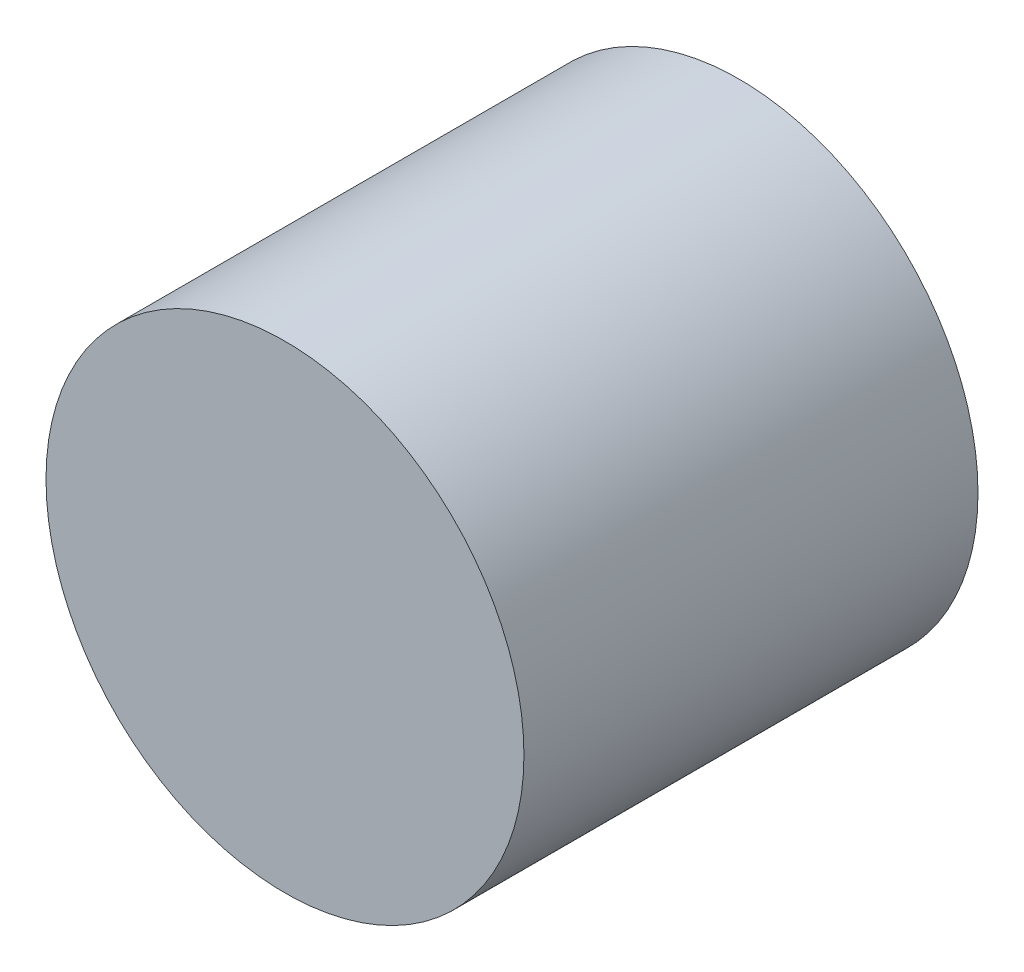
ISO-10303-21;
HEADER;
FILE_DESCRIPTION(('STEP AP214'),'2;1');
FILE_NAME('part.step','',(''),(''),'','','');
FILE_SCHEMA(('AUTOMOTIVE_DESIGN { 1 0 10303 214 1 1 1 1 }'));
ENDSEC;
DATA;
#1=APPLICATION_CONTEXT('core data for automotive mechanical design processes');
#2=APPLICATION_PROTOCOL_DEFINITION('international standard','automotive_design',2000,#1);
#3=PRODUCT_CONTEXT('',#1,'mechanical');
#4=PRODUCT('Part','Part','',(#3));
#5=PRODUCT_RELATED_PRODUCT_CATEGORY('part','',(#4));
#6=PRODUCT_DEFINITION_FORMATION('','',#4);
#7=PRODUCT_DEFINITION_CONTEXT('part definition',#1,'design');
#8=PRODUCT_DEFINITION('design','',#6,#7);
#9=PRODUCT_DEFINITION_SHAPE('','',#8);
#10=(LENGTH_UNIT() NAMED_UNIT(*) SI_UNIT(.MILLI.,.METRE.));
#11=(NAMED_UNIT(*) PLANE_ANGLE_UNIT() SI_UNIT($,.RADIAN.));
#12=(NAMED_UNIT(*) SI_UNIT($,.STERADIAN.) SOLID_ANGLE_UNIT());
#13=UNCERTAINTY_MEASURE_WITH_UNIT(LENGTH_MEASURE(1.E-05),#10,'distance_accuracy_value','');
#14=(GEOMETRIC_REPRESENTATION_CONTEXT(3) GLOBAL_UNCERTAINTY_ASSIGNED_CONTEXT((#13)) GLOBAL_UNIT_ASSIGNED_CONTEXT((#10,
#11,#12)) REPRESENTATION_CONTEXT('',''));
#15=CARTESIAN_POINT('',(0.,0.,0.));
#16=DIRECTION('',(0.,0.,1.));
#17=DIRECTION('',(1.,0.,0.));
#18=AXIS2_PLACEMENT_3D('',#15,#16,#17);
#19=CARTESIAN_POINT('',(-11.,20.,-16.8));
#20=DIRECTION('',(0.,0.,1.));
#21=DIRECTION('',(1.,0.,0.));
#22=AXIS2_PLACEMENT_3D('',#19,#20,#21);
#23=CYLINDRICAL_SURFACE('',#22,2.);
#24=CARTESIAN_POINT('',(-11.,20.,-16.8));
#25=DIRECTION('',(0.,0.,-1.));
#26=DIRECTION('',(-1.,0.,0.));
#27=AXIS2_PLACEMENT_3D('',#24,#25,#26);
#28=CIRCLE('',#27,2.);
#29=CARTESIAN_POINT('',(-13.,20.,-16.8));
#30=VERTEX_POINT('',#29);
#31=EDGE_CURVE('E11',#30,#30,#28,.T.);
#32=ORIENTED_EDGE('',*,*,#31,.F.);
#33=EDGE_LOOP('',(#32));
#34=FACE_BOUND('',#33,.T.);
#35=CARTESIAN_POINT('',(-11.,20.,-13.));
#36=DIRECTION('',(0.,0.,-1.));
#37=DIRECTION('',(-1.,0.,0.));
#38=AXIS2_PLACEMENT_3D('',#35,#36,#37);
#39=CIRCLE('',#38,2.);
#40=CARTESIAN_POINT('',(-13.,20.,-13.));
#41=VERTEX_POINT('',#40);
#42=EDGE_CURVE('E19',#41,#41,#39,.T.);
#43=ORIENTED_EDGE('',*,*,#42,.T.);
#44=EDGE_LOOP('',(#43));
#45=FACE_BOUND('',#44,.T.);
#46=ADVANCED_FACE('F16',(#34,#45),#23,.T.);
#47=CARTESIAN_POINT('',(-11.,20.,-16.8));
#48=DIRECTION('',(0.,0.,-1.));
#49=DIRECTION('',(-1.,0.,0.));
#50=AXIS2_PLACEMENT_3D('',#47,#48,#49);
#51=PLANE('',#50);
#52=DIRECTION('',(-0.602239243405244,-0.798315660439327,0.));
#53=VECTOR('',#52,1.);
#54=CARTESIAN_POINT('',(-9.56747668783013,19.8233356475596,-16.8));
#55=LINE('',#54,#53);
#56=CARTESIAN_POINT('',(-9.56747668783013,19.8233356475596,-16.8));
#57=VERTEX_POINT('',#56);
#58=CARTESIAN_POINT('',(-10.4367341610716,18.6710662439272,-16.8));
#59=VERTEX_POINT('',#58);
#60=EDGE_CURVE('E37',#57,#59,#55,.T.);
#61=ORIENTED_EDGE('',*,*,#60,.F.);
#62=DIRECTION('',(0.390242020476786,-0.920712314164526,0.));
#63=VECTOR('',#62,1.);
#64=CARTESIAN_POINT('',(-10.1307425267586,21.1522694036324,-16.8));
#65=LINE('',#64,#63);
#66=CARTESIAN_POINT('',(-10.1307425267586,21.1522694036324,-16.8));
#67=VERTEX_POINT('',#66);
#68=EDGE_CURVE('E153',#67,#57,#65,.T.);
#69=ORIENTED_EDGE('',*,*,#68,.F.);
#70=DIRECTION('',(0.992481263882031,-0.122396653725201,0.));
#71=VECTOR('',#70,1.);
#72=CARTESIAN_POINT('',(-11.5632658389284,21.3289337560727,-16.8));
#73=LINE('',#72,#71);
#74=CARTESIAN_POINT('',(-11.5632658389284,21.3289337560727,-16.8));
#75=VERTEX_POINT('',#74);
#76=EDGE_CURVE('E150',#75,#67,#73,.T.);
#77=ORIENTED_EDGE('',*,*,#76,.F.);
#78=DIRECTION('',(0.602239243405244,0.798315660439328,0.));
#79=VECTOR('',#78,1.);
#80=CARTESIAN_POINT('',(-12.4325233121699,20.1766643524404,-16.8));
#81=LINE('',#80,#79);
#82=CARTESIAN_POINT('',(-12.4325233121699,20.1766643524404,-16.8));
#83=VERTEX_POINT('',#82);
#84=EDGE_CURVE('E105',#83,#75,#81,.T.);
#85=ORIENTED_EDGE('',*,*,#84,.F.);
#86=DIRECTION('',(-0.390242020476786,0.920712314164525,0.));
#87=VECTOR('',#86,1.);
#88=CARTESIAN_POINT('',(-11.8692574732414,18.8477305963677,-16.8));
#89=LINE('',#88,#87);
#90=CARTESIAN_POINT('',(-11.8692574732414,18.8477305963677,-16.8));
#91=VERTEX_POINT('',#90);
#92=EDGE_CURVE('E144',#91,#83,#89,.T.);
#93=ORIENTED_EDGE('',*,*,#92,.F.);
#94=DIRECTION('',(-0.992481263882031,0.122396653725201,0.));
#95=VECTOR('',#94,1.);
#96=CARTESIAN_POINT('',(-10.4367341610716,18.6710662439272,-16.8));
#97=LINE('',#96,#95);
#98=EDGE_CURVE('E140',#59,#91,#97,.T.);
#99=ORIENTED_EDGE('',*,*,#98,.F.);
#100=EDGE_LOOP('',(#61,#69,#77,#85,#93,#99));
#101=FACE_BOUND('',#100,.T.);
#102=ORIENTED_EDGE('',*,*,#31,.T.);
#103=EDGE_LOOP('',(#102));
#104=FACE_BOUND('',#103,.T.);
#105=ADVANCED_FACE('F172',(#101,#104),#51,.T.);
#106=CARTESIAN_POINT('',(-11.,20.,-13.));
#107=DIRECTION('',(0.,0.,-1.));
#108=DIRECTION('',(-1.,0.,0.));
#109=AXIS2_PLACEMENT_3D('',#106,#107,#108);
#110=PLANE('',#109);
#111=ORIENTED_EDGE('',*,*,#42,.F.);
#112=EDGE_LOOP('',(#111));
#113=FACE_BOUND('',#112,.T.);
#114=ADVANCED_FACE('F221',(#113),#110,.F.);
#115=CARTESIAN_POINT('',(-9.56747668783013,19.8233356475596,-14.8));
#116=DIRECTION('',(0.798315660439327,-0.602239243405244,0.));
#117=DIRECTION('',(0.602239243405244,0.798315660439327,0.));
#118=AXIS2_PLACEMENT_3D('',#115,#116,#117);
#119=PLANE('',#118);
#120=ORIENTED_EDGE('',*,*,#60,.T.);
#121=DIRECTION('',(0.,0.,-1.));
#122=VECTOR('',#121,1.);
#123=CARTESIAN_POINT('',(-10.4367341610716,18.6710662439272,-14.8));
#124=LINE('',#123,#122);
#125=CARTESIAN_POINT('',(-10.4367341610716,18.6710662439272,-14.8));
#126=VERTEX_POINT('',#125);
#127=EDGE_CURVE('E83',#126,#59,#124,.T.);
#128=ORIENTED_EDGE('',*,*,#127,.F.);
#129=DIRECTION('',(-0.602239243405244,-0.798315660439327,0.));
#130=VECTOR('',#129,1.);
#131=CARTESIAN_POINT('',(-9.56747668783013,19.8233356475596,-14.8));
#132=LINE('',#131,#130);
#133=CARTESIAN_POINT('',(-9.56747668783013,19.8233356475596,-14.8));
#134=VERTEX_POINT('',#133);
#135=EDGE_CURVE('E155',#134,#126,#132,.T.);
#136=ORIENTED_EDGE('',*,*,#135,.F.);
#137=DIRECTION('',(0.,0.,-1.));
#138=VECTOR('',#137,1.);
#139=CARTESIAN_POINT('',(-9.56747668783013,19.8233356475596,-14.8));
#140=LINE('',#139,#138);
#141=EDGE_CURVE('E50',#134,#57,#140,.T.);
#142=ORIENTED_EDGE('',*,*,#141,.T.);
#143=EDGE_LOOP('',(#120,#128,#136,#142));
#144=FACE_BOUND('',#143,.T.);
#145=ADVANCED_FACE('F230',(#144),#119,.F.);
#146=CARTESIAN_POINT('',(-10.1307425267586,21.1522694036324,-14.8));
#147=DIRECTION('',(0.920712314164526,0.390242020476786,0.));
#148=DIRECTION('',(-0.390242020476786,0.920712314164526,0.));
#149=AXIS2_PLACEMENT_3D('',#146,#147,#148);
#150=PLANE('',#149);
#151=ORIENTED_EDGE('',*,*,#68,.T.);
#152=ORIENTED_EDGE('',*,*,#141,.F.);
#153=DIRECTION('',(0.390242020476786,-0.920712314164526,0.));
#154=VECTOR('',#153,1.);
#155=CARTESIAN_POINT('',(-10.1307425267586,21.1522694036324,-14.8));
#156=LINE('',#155,#154);
#157=CARTESIAN_POINT('',(-10.1307425267586,21.1522694036324,-14.8));
#158=VERTEX_POINT('',#157);
#159=EDGE_CURVE('E119',#158,#134,#156,.T.);
#160=ORIENTED_EDGE('',*,*,#159,.F.);
#161=DIRECTION('',(0.,0.,-1.));
#162=VECTOR('',#161,1.);
#163=CARTESIAN_POINT('',(-10.1307425267586,21.1522694036324,-14.8));
#164=LINE('',#163,#162);
#165=EDGE_CURVE('E110',#158,#67,#164,.T.);
#166=ORIENTED_EDGE('',*,*,#165,.T.);
#167=EDGE_LOOP('',(#151,#152,#160,#166));
#168=FACE_BOUND('',#167,.T.);
#169=ADVANCED_FACE('F238',(#168),#150,.F.);
#170=CARTESIAN_POINT('',(-11.5632658389284,21.3289337560727,-14.8));
#171=DIRECTION('',(0.122396653725201,0.992481263882031,0.));
#172=DIRECTION('',(-0.992481263882031,0.122396653725201,0.));
#173=AXIS2_PLACEMENT_3D('',#170,#171,#172);
#174=PLANE('',#173);
#175=ORIENTED_EDGE('',*,*,#76,.T.);
#176=ORIENTED_EDGE('',*,*,#165,.F.);
#177=DIRECTION('',(0.992481263882031,-0.122396653725201,0.));
#178=VECTOR('',#177,1.);
#179=CARTESIAN_POINT('',(-11.5632658389284,21.3289337560727,-14.8));
#180=LINE('',#179,#178);
#181=CARTESIAN_POINT('',(-11.5632658389284,21.3289337560727,-14.8));
#182=VERTEX_POINT('',#181);
#183=EDGE_CURVE('E114',#182,#158,#180,.T.);
#184=ORIENTED_EDGE('',*,*,#183,.F.);
#185=DIRECTION('',(0.,0.,-1.));
#186=VECTOR('',#185,1.);
#187=CARTESIAN_POINT('',(-11.5632658389284,21.3289337560727,-14.8));
#188=LINE('',#187,#186);
#189=EDGE_CURVE('E98',#182,#75,#188,.T.);
#190=ORIENTED_EDGE('',*,*,#189,.T.);
#191=EDGE_LOOP('',(#175,#176,#184,#190));
#192=FACE_BOUND('',#191,.T.);
#193=ADVANCED_FACE('F115',(#192),#174,.F.);
#194=CARTESIAN_POINT('',(-12.4325233121699,20.1766643524404,-14.8));
#195=DIRECTION('',(-0.798315660439328,0.602239243405244,0.));
#196=DIRECTION('',(-0.602239243405244,-0.798315660439328,0.));
#197=AXIS2_PLACEMENT_3D('',#194,#195,#196);
#198=PLANE('',#197);
#199=ORIENTED_EDGE('',*,*,#84,.T.);
#200=ORIENTED_EDGE('',*,*,#189,.F.);
#201=DIRECTION('',(0.602239243405244,0.798315660439328,0.));
#202=VECTOR('',#201,1.);
#203=CARTESIAN_POINT('',(-12.4325233121699,20.1766643524404,-14.8));
#204=LINE('',#203,#202);
#205=CARTESIAN_POINT('',(-12.4325233121699,20.1766643524404,-14.8));
#206=VERTEX_POINT('',#205);
#207=EDGE_CURVE('E102',#206,#182,#204,.T.);
#208=ORIENTED_EDGE('',*,*,#207,.F.);
#209=DIRECTION('',(0.,0.,-1.));
#210=VECTOR('',#209,1.);
#211=CARTESIAN_POINT('',(-12.4325233121699,20.1766643524404,-14.8));
#212=LINE('',#211,#210);
#213=EDGE_CURVE('E111',#206,#83,#212,.T.);
#214=ORIENTED_EDGE('',*,*,#213,.T.);
#215=EDGE_LOOP('',(#199,#200,#208,#214));
#216=FACE_BOUND('',#215,.T.);
#217=ADVANCED_FACE('F100',(#216),#198,.F.);
#218=CARTESIAN_POINT('',(-11.8692574732414,18.8477305963677,-14.8));
#219=DIRECTION('',(-0.920712314164525,-0.390242020476786,0.));
#220=DIRECTION('',(0.390242020476786,-0.920712314164525,0.));
#221=AXIS2_PLACEMENT_3D('',#218,#219,#220);
#222=PLANE('',#221);
#223=ORIENTED_EDGE('',*,*,#92,.T.);
#224=ORIENTED_EDGE('',*,*,#213,.F.);
#225=DIRECTION('',(-0.390242020476786,0.920712314164525,0.));
#226=VECTOR('',#225,1.);
#227=CARTESIAN_POINT('',(-11.8692574732414,18.8477305963677,-14.8));
#228=LINE('',#227,#226);
#229=CARTESIAN_POINT('',(-11.8692574732414,18.8477305963677,-14.8));
#230=VERTEX_POINT('',#229);
#231=EDGE_CURVE('E125',#230,#206,#228,.T.);
#232=ORIENTED_EDGE('',*,*,#231,.F.);
#233=DIRECTION('',(0.,0.,-1.));
#234=VECTOR('',#233,1.);
#235=CARTESIAN_POINT('',(-11.8692574732414,18.8477305963677,-14.8));
#236=LINE('',#235,#234);
#237=EDGE_CURVE('E161',#230,#91,#236,.T.);
#238=ORIENTED_EDGE('',*,*,#237,.T.);
#239=EDGE_LOOP('',(#223,#224,#232,#238));
#240=FACE_BOUND('',#239,.T.);
#241=ADVANCED_FACE('F176',(#240),#222,.F.);
#242=CARTESIAN_POINT('',(-10.4367341610716,18.6710662439272,-14.8));
#243=DIRECTION('',(-0.122396653725201,-0.992481263882031,0.));
#244=DIRECTION('',(0.992481263882031,-0.122396653725201,0.));
#245=AXIS2_PLACEMENT_3D('',#242,#243,#244);
#246=PLANE('',#245);
#247=ORIENTED_EDGE('',*,*,#98,.T.);
#248=ORIENTED_EDGE('',*,*,#237,.F.);
#249=DIRECTION('',(-0.992481263882031,0.122396653725201,0.));
#250=VECTOR('',#249,1.);
#251=CARTESIAN_POINT('',(-10.4367341610716,18.6710662439272,-14.8));
#252=LINE('',#251,#250);
#253=EDGE_CURVE('E132',#126,#230,#252,.T.);
#254=ORIENTED_EDGE('',*,*,#253,.F.);
#255=ORIENTED_EDGE('',*,*,#127,.T.);
#256=EDGE_LOOP('',(#247,#248,#254,#255));
#257=FACE_BOUND('',#256,.T.);
#258=ADVANCED_FACE('F169',(#257),#246,.F.);
#259=CARTESIAN_POINT('',(-10.4367341610716,18.6710662439272,-14.8));
#260=DIRECTION('',(0.,0.,-1.));
#261=DIRECTION('',(-1.,0.,0.));
#262=AXIS2_PLACEMENT_3D('',#259,#260,#261);
#263=PLANE('',#262);
#264=ORIENTED_EDGE('',*,*,#135,.T.);
#265=ORIENTED_EDGE('',*,*,#253,.T.);
#266=ORIENTED_EDGE('',*,*,#231,.T.);
#267=ORIENTED_EDGE('',*,*,#207,.T.);
#268=ORIENTED_EDGE('',*,*,#183,.T.);
#269=ORIENTED_EDGE('',*,*,#159,.T.);
#270=EDGE_LOOP('',(#264,#265,#266,#267,#268,#269));
#271=FACE_BOUND('',#270,.T.);
#272=ADVANCED_FACE('F122',(#271),#263,.T.);
#273=CLOSED_SHELL('',(#46,#105,#114,#145,#169,#193,#217,#241,#258,#272));
#274=MANIFOLD_SOLID_BREP('B1',#273);
#275=ADVANCED_BREP_SHAPE_REPRESENTATION('',(#18,#274),#14);
#276=SHAPE_DEFINITION_REPRESENTATION(#9,#275);
ENDSEC;
END-ISO-10303-21;
